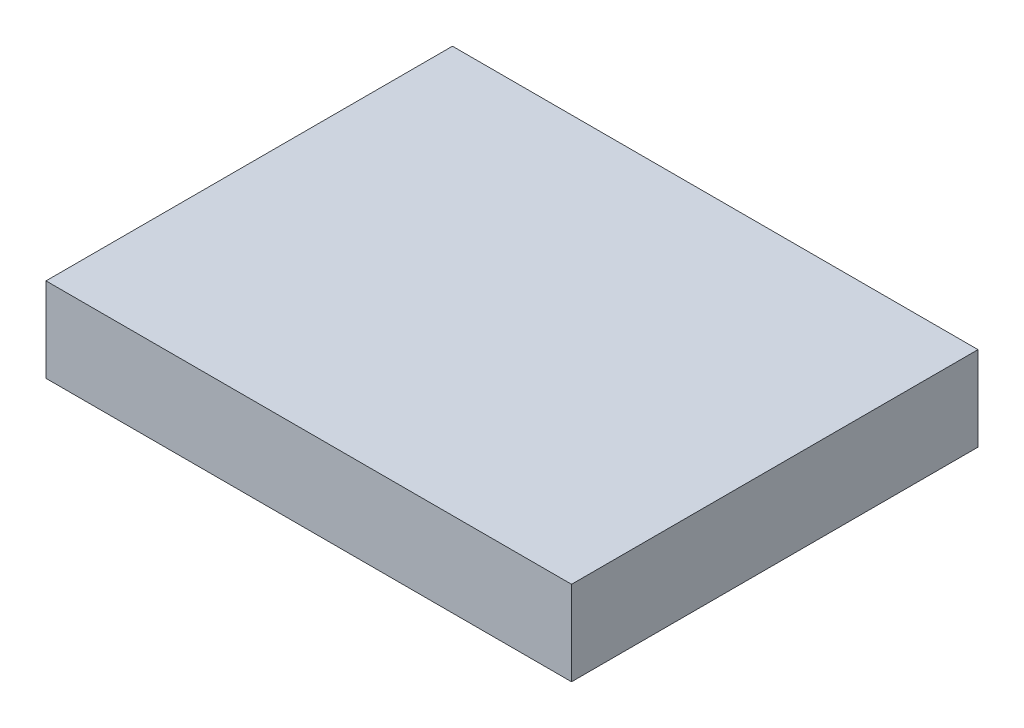
ISO-10303-21;
HEADER;
FILE_DESCRIPTION(('STEP AP214'),'2;1');
FILE_NAME('part.step','',(''),(''),'','','');
FILE_SCHEMA(('AUTOMOTIVE_DESIGN { 1 0 10303 214 1 1 1 1 }'));
ENDSEC;
DATA;
#1=APPLICATION_CONTEXT('core data for automotive mechanical design processes');
#2=APPLICATION_PROTOCOL_DEFINITION('international standard','automotive_design',2000,#1);
#3=PRODUCT_CONTEXT('',#1,'mechanical');
#4=PRODUCT('Part','Part','',(#3));
#5=PRODUCT_RELATED_PRODUCT_CATEGORY('part','',(#4));
#6=PRODUCT_DEFINITION_FORMATION('','',#4);
#7=PRODUCT_DEFINITION_CONTEXT('part definition',#1,'design');
#8=PRODUCT_DEFINITION('design','',#6,#7);
#9=PRODUCT_DEFINITION_SHAPE('','',#8);
#10=(LENGTH_UNIT() NAMED_UNIT(*) SI_UNIT(.MILLI.,.METRE.));
#11=(NAMED_UNIT(*) PLANE_ANGLE_UNIT() SI_UNIT($,.RADIAN.));
#12=(NAMED_UNIT(*) SI_UNIT($,.STERADIAN.) SOLID_ANGLE_UNIT());
#13=UNCERTAINTY_MEASURE_WITH_UNIT(LENGTH_MEASURE(1.E-05),#10,'distance_accuracy_value','');
#14=(GEOMETRIC_REPRESENTATION_CONTEXT(3) GLOBAL_UNCERTAINTY_ASSIGNED_CONTEXT((#13)) GLOBAL_UNIT_ASSIGNED_CONTEXT((#10,
#11,#12)) REPRESENTATION_CONTEXT('',''));
#15=CARTESIAN_POINT('',(0.,0.,0.));
#16=DIRECTION('',(0.,0.,1.));
#17=DIRECTION('',(1.,0.,0.));
#18=AXIS2_PLACEMENT_3D('',#15,#16,#17);
#19=CARTESIAN_POINT('',(-177.8,25.4,-68.753532784362));
#20=DIRECTION('',(0.,0.,-1.));
#21=DIRECTION('',(-1.,0.,0.));
#22=AXIS2_PLACEMENT_3D('',#19,#20,#21);
#23=PLANE('',#22);
#24=DIRECTION('',(0.,1.,0.));
#25=VECTOR('',#24,1.);
#26=CARTESIAN_POINT('',(0.,25.4,-68.753532784362));
#27=LINE('',#26,#25);
#28=CARTESIAN_POINT('',(0.,-3.175,-68.753532784362));
#29=VERTEX_POINT('',#28);
#30=CARTESIAN_POINT('',(0.,25.4,-68.753532784362));
#31=VERTEX_POINT('',#30);
#32=EDGE_CURVE('E95',#29,#31,#27,.T.);
#33=ORIENTED_EDGE('',*,*,#32,.F.);
#34=DIRECTION('',(1.,0.,0.));
#35=VECTOR('',#34,1.);
#36=CARTESIAN_POINT('',(-177.8,-3.175,-68.753532784362));
#37=LINE('',#36,#35);
#38=CARTESIAN_POINT('',(-177.8,-3.175,-68.753532784362));
#39=VERTEX_POINT('',#38);
#40=EDGE_CURVE('E11',#39,#29,#37,.T.);
#41=ORIENTED_EDGE('',*,*,#40,.F.);
#42=DIRECTION('',(0.,1.,0.));
#43=VECTOR('',#42,1.);
#44=CARTESIAN_POINT('',(-177.8,25.4,-68.753532784362));
#45=LINE('',#44,#43);
#46=CARTESIAN_POINT('',(-177.8,25.4,-68.753532784362));
#47=VERTEX_POINT('',#46);
#48=EDGE_CURVE('E89',#39,#47,#45,.T.);
#49=ORIENTED_EDGE('',*,*,#48,.T.);
#50=DIRECTION('',(1.,0.,0.));
#51=VECTOR('',#50,1.);
#52=CARTESIAN_POINT('',(-177.8,25.4,-68.753532784362));
#53=LINE('',#52,#51);
#54=EDGE_CURVE('E34',#47,#31,#53,.T.);
#55=ORIENTED_EDGE('',*,*,#54,.T.);
#56=EDGE_LOOP('',(#33,#41,#49,#55));
#57=FACE_BOUND('',#56,.T.);
#58=ADVANCED_FACE('F31',(#57),#23,.T.);
#59=CARTESIAN_POINT('',(-177.8,-3.175,68.753532784362));
#60=DIRECTION('',(0.,-1.,0.));
#61=DIRECTION('',(0.,0.,-1.));
#62=AXIS2_PLACEMENT_3D('',#59,#60,#61);
#63=PLANE('',#62);
#64=DIRECTION('',(0.,0.,-1.));
#65=VECTOR('',#64,1.);
#66=CARTESIAN_POINT('',(0.,-3.175,68.753532784362));
#67=LINE('',#66,#65);
#68=CARTESIAN_POINT('',(0.,-3.175,68.753532784362));
#69=VERTEX_POINT('',#68);
#70=EDGE_CURVE('E91',#69,#29,#67,.T.);
#71=ORIENTED_EDGE('',*,*,#70,.F.);
#72=DIRECTION('',(1.,0.,0.));
#73=VECTOR('',#72,1.);
#74=CARTESIAN_POINT('',(-177.8,-3.175,68.753532784362));
#75=LINE('',#74,#73);
#76=CARTESIAN_POINT('',(-177.8,-3.175,68.753532784362));
#77=VERTEX_POINT('',#76);
#78=EDGE_CURVE('E40',#77,#69,#75,.T.);
#79=ORIENTED_EDGE('',*,*,#78,.F.);
#80=DIRECTION('',(0.,0.,-1.));
#81=VECTOR('',#80,1.);
#82=CARTESIAN_POINT('',(-177.8,-3.175,68.753532784362));
#83=LINE('',#82,#81);
#84=EDGE_CURVE('E86',#77,#39,#83,.T.);
#85=ORIENTED_EDGE('',*,*,#84,.T.);
#86=ORIENTED_EDGE('',*,*,#40,.T.);
#87=EDGE_LOOP('',(#71,#79,#85,#86));
#88=FACE_BOUND('',#87,.T.);
#89=ADVANCED_FACE('F105',(#88),#63,.T.);
#90=CARTESIAN_POINT('',(-177.8,25.4,68.753532784362));
#91=DIRECTION('',(0.,0.,1.));
#92=DIRECTION('',(1.,0.,0.));
#93=AXIS2_PLACEMENT_3D('',#90,#91,#92);
#94=PLANE('',#93);
#95=DIRECTION('',(0.,-1.,0.));
#96=VECTOR('',#95,1.);
#97=CARTESIAN_POINT('',(0.,25.4,68.753532784362));
#98=LINE('',#97,#96);
#99=CARTESIAN_POINT('',(0.,25.4,68.753532784362));
#100=VERTEX_POINT('',#99);
#101=EDGE_CURVE('E81',#100,#69,#98,.T.);
#102=ORIENTED_EDGE('',*,*,#101,.F.);
#103=DIRECTION('',(1.,0.,0.));
#104=VECTOR('',#103,1.);
#105=CARTESIAN_POINT('',(-177.8,25.4,68.753532784362));
#106=LINE('',#105,#104);
#107=CARTESIAN_POINT('',(-177.8,25.4,68.753532784362));
#108=VERTEX_POINT('',#107);
#109=EDGE_CURVE('E76',#108,#100,#106,.T.);
#110=ORIENTED_EDGE('',*,*,#109,.F.);
#111=DIRECTION('',(0.,-1.,0.));
#112=VECTOR('',#111,1.);
#113=CARTESIAN_POINT('',(-177.8,25.4,68.753532784362));
#114=LINE('',#113,#112);
#115=EDGE_CURVE('E79',#108,#77,#114,.T.);
#116=ORIENTED_EDGE('',*,*,#115,.T.);
#117=ORIENTED_EDGE('',*,*,#78,.T.);
#118=EDGE_LOOP('',(#102,#110,#116,#117));
#119=FACE_BOUND('',#118,.T.);
#120=ADVANCED_FACE('F78',(#119),#94,.T.);
#121=CARTESIAN_POINT('',(-177.8,25.4,68.753532784362));
#122=DIRECTION('',(0.,1.,0.));
#123=DIRECTION('',(0.,0.,1.));
#124=AXIS2_PLACEMENT_3D('',#121,#122,#123);
#125=PLANE('',#124);
#126=DIRECTION('',(0.,0.,1.));
#127=VECTOR('',#126,1.);
#128=CARTESIAN_POINT('',(0.,25.4,68.753532784362));
#129=LINE('',#128,#127);
#130=EDGE_CURVE('E98',#31,#100,#129,.T.);
#131=ORIENTED_EDGE('',*,*,#130,.F.);
#132=ORIENTED_EDGE('',*,*,#54,.F.);
#133=DIRECTION('',(0.,0.,1.));
#134=VECTOR('',#133,1.);
#135=CARTESIAN_POINT('',(-177.8,25.4,68.753532784362));
#136=LINE('',#135,#134);
#137=EDGE_CURVE('E85',#47,#108,#136,.T.);
#138=ORIENTED_EDGE('',*,*,#137,.T.);
#139=ORIENTED_EDGE('',*,*,#109,.T.);
#140=EDGE_LOOP('',(#131,#132,#138,#139));
#141=FACE_BOUND('',#140,.T.);
#142=ADVANCED_FACE('F88',(#141),#125,.T.);
#143=CARTESIAN_POINT('',(-177.8,-3.175,-68.753532784362));
#144=DIRECTION('',(1.,0.,0.));
#145=DIRECTION('',(0.,0.,-1.));
#146=AXIS2_PLACEMENT_3D('',#143,#144,#145);
#147=PLANE('',#146);
#148=ORIENTED_EDGE('',*,*,#48,.F.);
#149=ORIENTED_EDGE('',*,*,#84,.F.);
#150=ORIENTED_EDGE('',*,*,#115,.F.);
#151=ORIENTED_EDGE('',*,*,#137,.F.);
#152=EDGE_LOOP('',(#148,#149,#150,#151));
#153=FACE_BOUND('',#152,.T.);
#154=ADVANCED_FACE('F84',(#153),#147,.F.);
#155=CARTESIAN_POINT('',(0.,-3.175,-68.753532784362));
#156=DIRECTION('',(1.,0.,0.));
#157=DIRECTION('',(0.,0.,-1.));
#158=AXIS2_PLACEMENT_3D('',#155,#156,#157);
#159=PLANE('',#158);
#160=ORIENTED_EDGE('',*,*,#32,.T.);
#161=ORIENTED_EDGE('',*,*,#130,.T.);
#162=ORIENTED_EDGE('',*,*,#101,.T.);
#163=ORIENTED_EDGE('',*,*,#70,.T.);
#164=EDGE_LOOP('',(#160,#161,#162,#163));
#165=FACE_BOUND('',#164,.T.);
#166=ADVANCED_FACE('F104',(#165),#159,.T.);
#167=CLOSED_SHELL('',(#58,#89,#120,#142,#154,#166));
#168=MANIFOLD_SOLID_BREP('B2',#167);
#169=ADVANCED_BREP_SHAPE_REPRESENTATION('',(#18,#168),#14);
#170=SHAPE_DEFINITION_REPRESENTATION(#9,#169);
ENDSEC;
END-ISO-10303-21;
